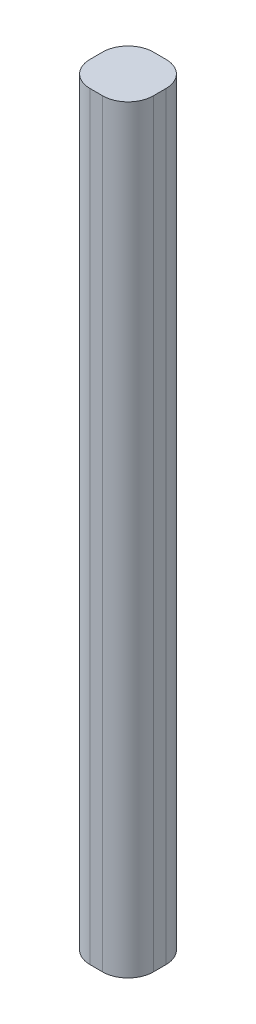
ISO-10303-21;
HEADER;
FILE_DESCRIPTION(('STEP AP214'),'2;1');
FILE_NAME('part.step','',(''),(''),'','','');
FILE_SCHEMA(('AUTOMOTIVE_DESIGN { 1 0 10303 214 1 1 1 1 }'));
ENDSEC;
DATA;
#1=APPLICATION_CONTEXT('core data for automotive mechanical design processes');
#2=APPLICATION_PROTOCOL_DEFINITION('international standard','automotive_design',2000,#1);
#3=PRODUCT_CONTEXT('',#1,'mechanical');
#4=PRODUCT('Part','Part','',(#3));
#5=PRODUCT_RELATED_PRODUCT_CATEGORY('part','',(#4));
#6=PRODUCT_DEFINITION_FORMATION('','',#4);
#7=PRODUCT_DEFINITION_CONTEXT('part definition',#1,'design');
#8=PRODUCT_DEFINITION('design','',#6,#7);
#9=PRODUCT_DEFINITION_SHAPE('','',#8);
#10=(LENGTH_UNIT() NAMED_UNIT(*) SI_UNIT(.MILLI.,.METRE.));
#11=(NAMED_UNIT(*) PLANE_ANGLE_UNIT() SI_UNIT($,.RADIAN.));
#12=(NAMED_UNIT(*) SI_UNIT($,.STERADIAN.) SOLID_ANGLE_UNIT());
#13=UNCERTAINTY_MEASURE_WITH_UNIT(LENGTH_MEASURE(1.E-05),#10,'distance_accuracy_value','');
#14=(GEOMETRIC_REPRESENTATION_CONTEXT(3) GLOBAL_UNCERTAINTY_ASSIGNED_CONTEXT((#13)) GLOBAL_UNIT_ASSIGNED_CONTEXT((#10,
#11,#12)) REPRESENTATION_CONTEXT('',''));
#15=CARTESIAN_POINT('',(0.,0.,0.));
#16=DIRECTION('',(0.,0.,1.));
#17=DIRECTION('',(1.,0.,0.));
#18=AXIS2_PLACEMENT_3D('',#15,#16,#17);
#19=CARTESIAN_POINT('',(-2.5,60.,2.5));
#20=DIRECTION('',(1.,0.,0.));
#21=DIRECTION('',(0.,0.,-1.));
#22=AXIS2_PLACEMENT_3D('',#19,#20,#21);
#23=PLANE('',#22);
#24=DIRECTION('',(0.,0.,1.));
#25=VECTOR('',#24,1.);
#26=CARTESIAN_POINT('',(-2.5,60.,2.5));
#27=LINE('',#26,#25);
#28=CARTESIAN_POINT('',(-2.5,60.,-0.5));
#29=VERTEX_POINT('',#28);
#30=CARTESIAN_POINT('',(-2.5,60.,0.5));
#31=VERTEX_POINT('',#30);
#32=EDGE_CURVE('E131',#29,#31,#27,.T.);
#33=ORIENTED_EDGE('',*,*,#32,.F.);
#34=DIRECTION('',(0.,-1.,0.));
#35=VECTOR('',#34,1.);
#36=CARTESIAN_POINT('',(-2.5,60.,-0.5));
#37=LINE('',#36,#35);
#38=CARTESIAN_POINT('',(-2.5,0.,-0.5));
#39=VERTEX_POINT('',#38);
#40=EDGE_CURVE('E115',#29,#39,#37,.T.);
#41=ORIENTED_EDGE('',*,*,#40,.T.);
#42=DIRECTION('',(0.,0.,1.));
#43=VECTOR('',#42,1.);
#44=CARTESIAN_POINT('',(-2.5,0.,2.5));
#45=LINE('',#44,#43);
#46=CARTESIAN_POINT('',(-2.5,0.,0.5));
#47=VERTEX_POINT('',#46);
#48=EDGE_CURVE('E128',#39,#47,#45,.T.);
#49=ORIENTED_EDGE('',*,*,#48,.T.);
#50=DIRECTION('',(0.,-1.,0.));
#51=VECTOR('',#50,1.);
#52=CARTESIAN_POINT('',(-2.5,60.,0.5));
#53=LINE('',#52,#51);
#54=EDGE_CURVE('E134',#47,#31,#53,.F.);
#55=ORIENTED_EDGE('',*,*,#54,.T.);
#56=EDGE_LOOP('',(#33,#41,#49,#55));
#57=FACE_BOUND('',#56,.T.);
#58=ADVANCED_FACE('F43',(#57),#23,.F.);
#59=CARTESIAN_POINT('',(2.5,60.,2.5));
#60=DIRECTION('',(0.,0.,-1.));
#61=DIRECTION('',(-1.,0.,0.));
#62=AXIS2_PLACEMENT_3D('',#59,#60,#61);
#63=PLANE('',#62);
#64=DIRECTION('',(1.,0.,0.));
#65=VECTOR('',#64,1.);
#66=CARTESIAN_POINT('',(2.5,60.,2.5));
#67=LINE('',#66,#65);
#68=CARTESIAN_POINT('',(-0.5,60.,2.5));
#69=VERTEX_POINT('',#68);
#70=CARTESIAN_POINT('',(0.5,60.,2.5));
#71=VERTEX_POINT('',#70);
#72=EDGE_CURVE('E189',#69,#71,#67,.T.);
#73=ORIENTED_EDGE('',*,*,#72,.F.);
#74=DIRECTION('',(0.,-1.,0.));
#75=VECTOR('',#74,1.);
#76=CARTESIAN_POINT('',(-0.5,60.,2.5));
#77=LINE('',#76,#75);
#78=CARTESIAN_POINT('',(-0.5,0.,2.5));
#79=VERTEX_POINT('',#78);
#80=EDGE_CURVE('E11',#69,#79,#77,.T.);
#81=ORIENTED_EDGE('',*,*,#80,.T.);
#82=DIRECTION('',(1.,0.,0.));
#83=VECTOR('',#82,1.);
#84=CARTESIAN_POINT('',(2.5,0.,2.5));
#85=LINE('',#84,#83);
#86=CARTESIAN_POINT('',(0.5,0.,2.5));
#87=VERTEX_POINT('',#86);
#88=EDGE_CURVE('E140',#79,#87,#85,.T.);
#89=ORIENTED_EDGE('',*,*,#88,.T.);
#90=DIRECTION('',(0.,-1.,0.));
#91=VECTOR('',#90,1.);
#92=CARTESIAN_POINT('',(0.5,60.,2.5));
#93=LINE('',#92,#91);
#94=EDGE_CURVE('E52',#87,#71,#93,.F.);
#95=ORIENTED_EDGE('',*,*,#94,.T.);
#96=EDGE_LOOP('',(#73,#81,#89,#95));
#97=FACE_BOUND('',#96,.T.);
#98=ADVANCED_FACE('F188',(#97),#63,.F.);
#99=CARTESIAN_POINT('',(2.5,60.,2.5));
#100=DIRECTION('',(-1.,0.,0.));
#101=DIRECTION('',(0.,0.,1.));
#102=AXIS2_PLACEMENT_3D('',#99,#100,#101);
#103=PLANE('',#102);
#104=DIRECTION('',(0.,0.,-1.));
#105=VECTOR('',#104,1.);
#106=CARTESIAN_POINT('',(2.5,0.,2.5));
#107=LINE('',#106,#105);
#108=CARTESIAN_POINT('',(2.5,0.,0.5));
#109=VERTEX_POINT('',#108);
#110=CARTESIAN_POINT('',(2.5,0.,-0.5));
#111=VERTEX_POINT('',#110);
#112=EDGE_CURVE('E144',#109,#111,#107,.T.);
#113=ORIENTED_EDGE('',*,*,#112,.T.);
#114=DIRECTION('',(0.,-1.,0.));
#115=VECTOR('',#114,1.);
#116=CARTESIAN_POINT('',(2.5,60.,-0.5));
#117=LINE('',#116,#115);
#118=CARTESIAN_POINT('',(2.5,60.,-0.5));
#119=VERTEX_POINT('',#118);
#120=EDGE_CURVE('E59',#111,#119,#117,.F.);
#121=ORIENTED_EDGE('',*,*,#120,.T.);
#122=DIRECTION('',(0.,0.,-1.));
#123=VECTOR('',#122,1.);
#124=CARTESIAN_POINT('',(2.5,60.,2.5));
#125=LINE('',#124,#123);
#126=CARTESIAN_POINT('',(2.5,60.,0.5));
#127=VERTEX_POINT('',#126);
#128=EDGE_CURVE('E196',#127,#119,#125,.T.);
#129=ORIENTED_EDGE('',*,*,#128,.F.);
#130=DIRECTION('',(0.,-1.,0.));
#131=VECTOR('',#130,1.);
#132=CARTESIAN_POINT('',(2.5,60.,0.5));
#133=LINE('',#132,#131);
#134=EDGE_CURVE('E179',#127,#109,#133,.T.);
#135=ORIENTED_EDGE('',*,*,#134,.T.);
#136=EDGE_LOOP('',(#113,#121,#129,#135));
#137=FACE_BOUND('',#136,.T.);
#138=ADVANCED_FACE('F200',(#137),#103,.F.);
#139=CARTESIAN_POINT('',(2.5,60.,-2.5));
#140=DIRECTION('',(0.,0.,1.));
#141=DIRECTION('',(1.,0.,0.));
#142=AXIS2_PLACEMENT_3D('',#139,#140,#141);
#143=PLANE('',#142);
#144=DIRECTION('',(-1.,0.,0.));
#145=VECTOR('',#144,1.);
#146=CARTESIAN_POINT('',(2.5,0.,-2.5));
#147=LINE('',#146,#145);
#148=CARTESIAN_POINT('',(0.499999999999999,0.,-2.5));
#149=VERTEX_POINT('',#148);
#150=CARTESIAN_POINT('',(-0.500000000000001,0.,-2.5));
#151=VERTEX_POINT('',#150);
#152=EDGE_CURVE('E152',#149,#151,#147,.T.);
#153=ORIENTED_EDGE('',*,*,#152,.T.);
#154=DIRECTION('',(0.,-1.,0.));
#155=VECTOR('',#154,1.);
#156=CARTESIAN_POINT('',(-0.500000000000001,60.,-2.5));
#157=LINE('',#156,#155);
#158=CARTESIAN_POINT('',(-0.500000000000001,60.,-2.5));
#159=VERTEX_POINT('',#158);
#160=EDGE_CURVE('E116',#151,#159,#157,.F.);
#161=ORIENTED_EDGE('',*,*,#160,.T.);
#162=DIRECTION('',(-1.,0.,0.));
#163=VECTOR('',#162,1.);
#164=CARTESIAN_POINT('',(2.5,60.,-2.5));
#165=LINE('',#164,#163);
#166=CARTESIAN_POINT('',(0.499999999999999,60.,-2.5));
#167=VERTEX_POINT('',#166);
#168=EDGE_CURVE('E147',#167,#159,#165,.T.);
#169=ORIENTED_EDGE('',*,*,#168,.F.);
#170=DIRECTION('',(0.,-1.,0.));
#171=VECTOR('',#170,1.);
#172=CARTESIAN_POINT('',(0.499999999999999,60.,-2.5));
#173=LINE('',#172,#171);
#174=EDGE_CURVE('E122',#167,#149,#173,.T.);
#175=ORIENTED_EDGE('',*,*,#174,.T.);
#176=EDGE_LOOP('',(#153,#161,#169,#175));
#177=FACE_BOUND('',#176,.T.);
#178=ADVANCED_FACE('F207',(#177),#143,.F.);
#179=CARTESIAN_POINT('',(0.,60.,0.));
#180=DIRECTION('',(0.,1.,0.));
#181=DIRECTION('',(0.,0.,1.));
#182=AXIS2_PLACEMENT_3D('',#179,#180,#181);
#183=PLANE('',#182);
#184=ORIENTED_EDGE('',*,*,#168,.T.);
#185=CARTESIAN_POINT('',(-0.500000000000001,60.,-0.5));
#186=DIRECTION('',(0.,1.,0.));
#187=DIRECTION('',(0.,0.,1.));
#188=AXIS2_PLACEMENT_3D('',#185,#186,#187);
#189=CIRCLE('',#188,2.);
#190=EDGE_CURVE('E176',#159,#29,#189,.T.);
#191=ORIENTED_EDGE('',*,*,#190,.T.);
#192=ORIENTED_EDGE('',*,*,#32,.T.);
#193=CARTESIAN_POINT('',(-0.500000000000001,60.,0.5));
#194=DIRECTION('',(0.,1.,0.));
#195=DIRECTION('',(0.,0.,1.));
#196=AXIS2_PLACEMENT_3D('',#193,#194,#195);
#197=CIRCLE('',#196,2.);
#198=EDGE_CURVE('E170',#31,#69,#197,.T.);
#199=ORIENTED_EDGE('',*,*,#198,.T.);
#200=ORIENTED_EDGE('',*,*,#72,.T.);
#201=CARTESIAN_POINT('',(0.499999999999999,60.,0.5));
#202=DIRECTION('',(0.,1.,0.));
#203=DIRECTION('',(0.,0.,1.));
#204=AXIS2_PLACEMENT_3D('',#201,#202,#203);
#205=CIRCLE('',#204,2.);
#206=EDGE_CURVE('E66',#71,#127,#205,.T.);
#207=ORIENTED_EDGE('',*,*,#206,.T.);
#208=ORIENTED_EDGE('',*,*,#128,.T.);
#209=CARTESIAN_POINT('',(0.499999999999999,60.,-0.5));
#210=DIRECTION('',(0.,1.,0.));
#211=DIRECTION('',(0.,0.,1.));
#212=AXIS2_PLACEMENT_3D('',#209,#210,#211);
#213=CIRCLE('',#212,2.);
#214=EDGE_CURVE('E173',#119,#167,#213,.T.);
#215=ORIENTED_EDGE('',*,*,#214,.T.);
#216=EDGE_LOOP('',(#184,#191,#192,#199,#200,#207,#208,#215));
#217=FACE_BOUND('',#216,.T.);
#218=ADVANCED_FACE('F193',(#217),#183,.T.);
#219=CARTESIAN_POINT('',(0.,0.,0.));
#220=DIRECTION('',(0.,1.,0.));
#221=DIRECTION('',(0.,0.,1.));
#222=AXIS2_PLACEMENT_3D('',#219,#220,#221);
#223=PLANE('',#222);
#224=ORIENTED_EDGE('',*,*,#48,.F.);
#225=CARTESIAN_POINT('',(-0.500000000000001,0.,-0.5));
#226=DIRECTION('',(0.,1.,0.));
#227=DIRECTION('',(0.,0.,1.));
#228=AXIS2_PLACEMENT_3D('',#225,#226,#227);
#229=CIRCLE('',#228,2.);
#230=EDGE_CURVE('E111',#39,#151,#229,.F.);
#231=ORIENTED_EDGE('',*,*,#230,.T.);
#232=ORIENTED_EDGE('',*,*,#152,.F.);
#233=CARTESIAN_POINT('',(0.499999999999999,0.,-0.5));
#234=DIRECTION('',(0.,1.,0.));
#235=DIRECTION('',(0.,0.,1.));
#236=AXIS2_PLACEMENT_3D('',#233,#234,#235);
#237=CIRCLE('',#236,2.);
#238=EDGE_CURVE('E123',#149,#111,#237,.F.);
#239=ORIENTED_EDGE('',*,*,#238,.T.);
#240=ORIENTED_EDGE('',*,*,#112,.F.);
#241=CARTESIAN_POINT('',(0.499999999999999,0.,0.5));
#242=DIRECTION('',(0.,1.,0.));
#243=DIRECTION('',(0.,0.,1.));
#244=AXIS2_PLACEMENT_3D('',#241,#242,#243);
#245=CIRCLE('',#244,2.);
#246=EDGE_CURVE('E133',#109,#87,#245,.F.);
#247=ORIENTED_EDGE('',*,*,#246,.T.);
#248=ORIENTED_EDGE('',*,*,#88,.F.);
#249=CARTESIAN_POINT('',(-0.500000000000001,0.,0.5));
#250=DIRECTION('',(0.,1.,0.));
#251=DIRECTION('',(0.,0.,1.));
#252=AXIS2_PLACEMENT_3D('',#249,#250,#251);
#253=CIRCLE('',#252,2.);
#254=EDGE_CURVE('E138',#79,#47,#253,.F.);
#255=ORIENTED_EDGE('',*,*,#254,.T.);
#256=EDGE_LOOP('',(#224,#231,#232,#239,#240,#247,#248,#255));
#257=FACE_BOUND('',#256,.T.);
#258=ADVANCED_FACE('F136',(#257),#223,.F.);
#259=CARTESIAN_POINT('',(-0.500000000000001,60.,-0.5));
#260=DIRECTION('',(0.,-1.,0.));
#261=DIRECTION('',(0.,0.,-1.));
#262=AXIS2_PLACEMENT_3D('',#259,#260,#261);
#263=CYLINDRICAL_SURFACE('',#262,2.);
#264=ORIENTED_EDGE('',*,*,#190,.F.);
#265=ORIENTED_EDGE('',*,*,#160,.F.);
#266=ORIENTED_EDGE('',*,*,#230,.F.);
#267=ORIENTED_EDGE('',*,*,#40,.F.);
#268=EDGE_LOOP('',(#264,#265,#266,#267));
#269=FACE_BOUND('',#268,.T.);
#270=ADVANCED_FACE('F114',(#269),#263,.T.);
#271=CARTESIAN_POINT('',(0.499999999999999,60.,-0.5));
#272=DIRECTION('',(0.,-1.,0.));
#273=DIRECTION('',(0.,0.,-1.));
#274=AXIS2_PLACEMENT_3D('',#271,#272,#273);
#275=CYLINDRICAL_SURFACE('',#274,2.);
#276=ORIENTED_EDGE('',*,*,#214,.F.);
#277=ORIENTED_EDGE('',*,*,#120,.F.);
#278=ORIENTED_EDGE('',*,*,#238,.F.);
#279=ORIENTED_EDGE('',*,*,#174,.F.);
#280=EDGE_LOOP('',(#276,#277,#278,#279));
#281=FACE_BOUND('',#280,.T.);
#282=ADVANCED_FACE('F204',(#281),#275,.T.);
#283=CARTESIAN_POINT('',(-0.500000000000001,60.,0.5));
#284=DIRECTION('',(0.,-1.,0.));
#285=DIRECTION('',(0.,0.,-1.));
#286=AXIS2_PLACEMENT_3D('',#283,#284,#285);
#287=CYLINDRICAL_SURFACE('',#286,2.);
#288=ORIENTED_EDGE('',*,*,#198,.F.);
#289=ORIENTED_EDGE('',*,*,#54,.F.);
#290=ORIENTED_EDGE('',*,*,#254,.F.);
#291=ORIENTED_EDGE('',*,*,#80,.F.);
#292=EDGE_LOOP('',(#288,#289,#290,#291));
#293=FACE_BOUND('',#292,.T.);
#294=ADVANCED_FACE('F213',(#293),#287,.T.);
#295=CARTESIAN_POINT('',(0.499999999999999,60.,0.5));
#296=DIRECTION('',(0.,-1.,0.));
#297=DIRECTION('',(0.,0.,-1.));
#298=AXIS2_PLACEMENT_3D('',#295,#296,#297);
#299=CYLINDRICAL_SURFACE('',#298,2.);
#300=ORIENTED_EDGE('',*,*,#206,.F.);
#301=ORIENTED_EDGE('',*,*,#94,.F.);
#302=ORIENTED_EDGE('',*,*,#246,.F.);
#303=ORIENTED_EDGE('',*,*,#134,.F.);
#304=EDGE_LOOP('',(#300,#301,#302,#303));
#305=FACE_BOUND('',#304,.T.);
#306=ADVANCED_FACE('F45',(#305),#299,.T.);
#307=CLOSED_SHELL('',(#58,#98,#138,#178,#218,#258,#270,#282,#294,#306));
#308=MANIFOLD_SOLID_BREP('B2',#307);
#309=ADVANCED_BREP_SHAPE_REPRESENTATION('',(#18,#308),#14);
#310=SHAPE_DEFINITION_REPRESENTATION(#9,#309);
ENDSEC;
END-ISO-10303-21;
